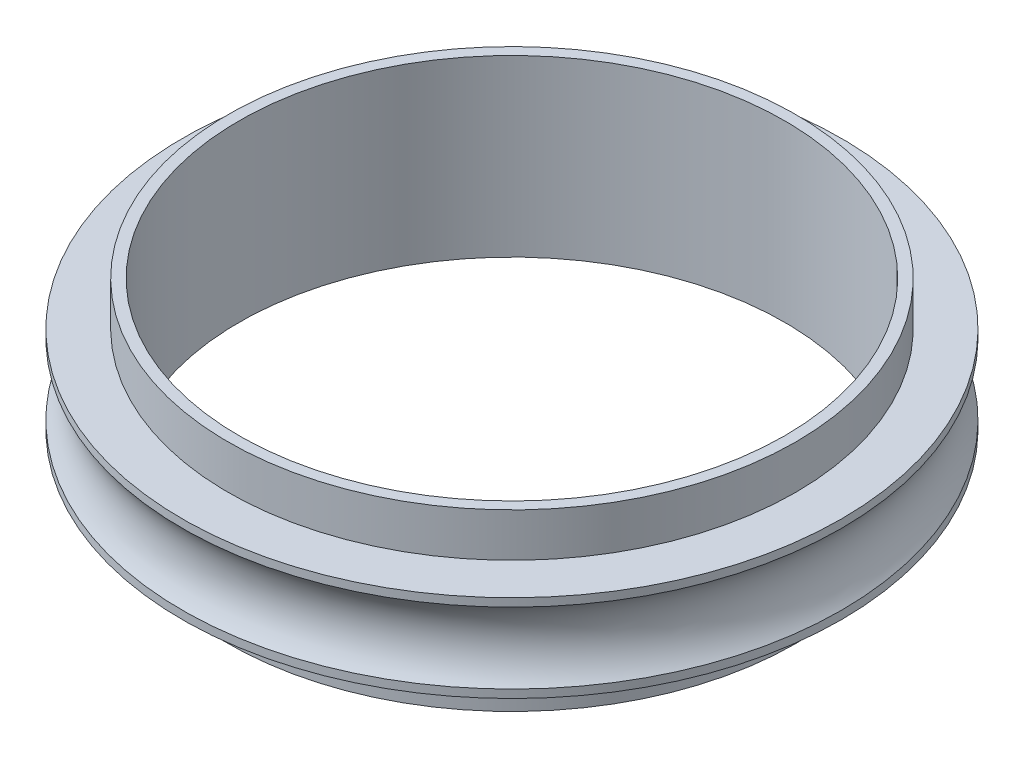
ISO-10303-21;
HEADER;
FILE_DESCRIPTION(('STEP AP214'),'2;1');
FILE_NAME('part.step','',(''),(''),'','','');
FILE_SCHEMA(('AUTOMOTIVE_DESIGN { 1 0 10303 214 1 1 1 1 }'));
ENDSEC;
DATA;
#1=APPLICATION_CONTEXT('core data for automotive mechanical design processes');
#2=APPLICATION_PROTOCOL_DEFINITION('international standard','automotive_design',2000,#1);
#3=PRODUCT_CONTEXT('',#1,'mechanical');
#4=PRODUCT('Part','Part','',(#3));
#5=PRODUCT_RELATED_PRODUCT_CATEGORY('part','',(#4));
#6=PRODUCT_DEFINITION_FORMATION('','',#4);
#7=PRODUCT_DEFINITION_CONTEXT('part definition',#1,'design');
#8=PRODUCT_DEFINITION('design','',#6,#7);
#9=PRODUCT_DEFINITION_SHAPE('','',#8);
#10=(LENGTH_UNIT() NAMED_UNIT(*) SI_UNIT(.MILLI.,.METRE.));
#11=(NAMED_UNIT(*) PLANE_ANGLE_UNIT() SI_UNIT($,.RADIAN.));
#12=(NAMED_UNIT(*) SI_UNIT($,.STERADIAN.) SOLID_ANGLE_UNIT());
#13=UNCERTAINTY_MEASURE_WITH_UNIT(LENGTH_MEASURE(1.E-05),#10,'distance_accuracy_value','');
#14=(GEOMETRIC_REPRESENTATION_CONTEXT(3) GLOBAL_UNCERTAINTY_ASSIGNED_CONTEXT((#13)) GLOBAL_UNIT_ASSIGNED_CONTEXT((#10,
#11,#12)) REPRESENTATION_CONTEXT('',''));
#15=CARTESIAN_POINT('',(0.,0.,0.));
#16=DIRECTION('',(0.,0.,1.));
#17=DIRECTION('',(1.,0.,0.));
#18=AXIS2_PLACEMENT_3D('',#15,#16,#17);
#19=CARTESIAN_POINT('',(17.,4.4,0.));
#20=DIRECTION('',(0.,-1.,0.));
#21=DIRECTION('',(-1.,0.,0.));
#22=AXIS2_PLACEMENT_3D('',#19,#20,#21);
#23=CYLINDRICAL_SURFACE('',#22,13.);
#24=CARTESIAN_POINT('',(17.,2.,0.));
#25=DIRECTION('',(0.,-1.,0.));
#26=DIRECTION('',(-1.,0.,0.));
#27=AXIS2_PLACEMENT_3D('',#24,#25,#26);
#28=CIRCLE('',#27,13.);
#29=CARTESIAN_POINT('',(30.,2.,0.));
#30=VERTEX_POINT('',#29);
#31=EDGE_CURVE('E26',#30,#30,#28,.T.);
#32=ORIENTED_EDGE('',*,*,#31,.F.);
#33=DIRECTION('',(0.,1.,0.));
#34=VECTOR('',#33,1.);
#35=CARTESIAN_POINT('',(30.,4.4,0.));
#36=LINE('',#35,#34);
#37=CARTESIAN_POINT('',(30.,4.,0.));
#38=VERTEX_POINT('',#37);
#39=EDGE_CURVE('E11',#30,#38,#36,.T.);
#40=ORIENTED_EDGE('',*,*,#39,.T.);
#41=CARTESIAN_POINT('',(17.,4.,0.));
#42=DIRECTION('',(0.,1.,0.));
#43=DIRECTION('',(-1.,0.,0.));
#44=AXIS2_PLACEMENT_3D('',#41,#42,#43);
#45=CIRCLE('',#44,13.);
#46=EDGE_CURVE('E105',#38,#38,#45,.T.);
#47=ORIENTED_EDGE('',*,*,#46,.F.);
#48=ORIENTED_EDGE('',*,*,#39,.F.);
#49=EDGE_LOOP('',(#32,#40,#47,#48));
#50=FACE_BOUND('',#49,.T.);
#51=ADVANCED_FACE('F17',(#50),#23,.T.);
#52=CARTESIAN_POINT('',(17.,2.,0.));
#53=DIRECTION('',(0.,-1.,0.));
#54=DIRECTION('',(0.,0.,-1.));
#55=AXIS2_PLACEMENT_3D('',#52,#53,#54);
#56=PLANE('',#55);
#57=ORIENTED_EDGE('',*,*,#31,.T.);
#58=EDGE_LOOP('',(#57));
#59=FACE_BOUND('',#58,.T.);
#60=CARTESIAN_POINT('',(17.,2.,0.));
#61=DIRECTION('',(0.,-1.,0.));
#62=DIRECTION('',(-1.,0.,0.));
#63=AXIS2_PLACEMENT_3D('',#60,#61,#62);
#64=CIRCLE('',#63,15.1);
#65=CARTESIAN_POINT('',(32.1,2.,0.));
#66=VERTEX_POINT('',#65);
#67=EDGE_CURVE('E116',#66,#66,#64,.T.);
#68=ORIENTED_EDGE('',*,*,#67,.F.);
#69=EDGE_LOOP('',(#68));
#70=FACE_BOUND('',#69,.T.);
#71=ADVANCED_FACE('F210',(#59,#70),#56,.F.);
#72=CARTESIAN_POINT('',(17.,4.4,0.));
#73=DIRECTION('',(0.,-1.,0.));
#74=DIRECTION('',(-1.,0.,0.));
#75=AXIS2_PLACEMENT_3D('',#72,#73,#74);
#76=CYLINDRICAL_SURFACE('',#75,15.1);
#77=CARTESIAN_POINT('',(17.,1.624807680927,0.));
#78=DIRECTION('',(0.,-1.,0.));
#79=DIRECTION('',(-1.,0.,0.));
#80=AXIS2_PLACEMENT_3D('',#77,#78,#79);
#81=CIRCLE('',#80,15.1);
#82=CARTESIAN_POINT('',(32.1,1.624807680927,0.));
#83=VERTEX_POINT('',#82);
#84=EDGE_CURVE('E145',#83,#83,#81,.T.);
#85=ORIENTED_EDGE('',*,*,#84,.F.);
#86=DIRECTION('',(0.,1.,0.));
#87=VECTOR('',#86,1.);
#88=CARTESIAN_POINT('',(32.1,4.4,0.));
#89=LINE('',#88,#87);
#90=EDGE_CURVE('E60',#83,#66,#89,.T.);
#91=ORIENTED_EDGE('',*,*,#90,.T.);
#92=ORIENTED_EDGE('',*,*,#67,.T.);
#93=ORIENTED_EDGE('',*,*,#90,.F.);
#94=EDGE_LOOP('',(#85,#91,#92,#93));
#95=FACE_BOUND('',#94,.T.);
#96=ADVANCED_FACE('F185',(#95),#76,.T.);
#97=CARTESIAN_POINT('',(17.,0.,0.));
#98=DIRECTION('',(0.,-1.,0.));
#99=DIRECTION('',(-1.,0.,0.));
#100=AXIS2_PLACEMENT_3D('',#97,#98,#99);
#101=TOROIDAL_SURFACE('',#100,17.,2.5);
#102=CARTESIAN_POINT('',(17.,-1.624807680927,0.));
#103=DIRECTION('',(0.,-1.,0.));
#104=DIRECTION('',(-1.,0.,0.));
#105=AXIS2_PLACEMENT_3D('',#102,#103,#104);
#106=CIRCLE('',#105,15.1);
#107=CARTESIAN_POINT('',(32.1,-1.624807680927,0.));
#108=VERTEX_POINT('',#107);
#109=EDGE_CURVE('E125',#108,#108,#106,.T.);
#110=ORIENTED_EDGE('',*,*,#109,.F.);
#111=CARTESIAN_POINT('',(34.,0.,0.));
#112=DIRECTION('',(0.,0.,-1.));
#113=DIRECTION('',(1.,0.,0.));
#114=AXIS2_PLACEMENT_3D('',#111,#112,#113);
#115=CIRCLE('',#114,2.5);
#116=EDGE_CURVE('E68',#108,#83,#115,.T.);
#117=ORIENTED_EDGE('',*,*,#116,.T.);
#118=ORIENTED_EDGE('',*,*,#84,.T.);
#119=ORIENTED_EDGE('',*,*,#116,.F.);
#120=EDGE_LOOP('',(#110,#117,#118,#119));
#121=FACE_BOUND('',#120,.T.);
#122=ADVANCED_FACE('F179',(#121),#101,.F.);
#123=CARTESIAN_POINT('',(17.,4.4,0.));
#124=DIRECTION('',(0.,-1.,0.));
#125=DIRECTION('',(-1.,0.,0.));
#126=AXIS2_PLACEMENT_3D('',#123,#124,#125);
#127=CYLINDRICAL_SURFACE('',#126,15.1);
#128=CARTESIAN_POINT('',(17.,-2.,0.));
#129=DIRECTION('',(0.,-1.,0.));
#130=DIRECTION('',(-1.,0.,0.));
#131=AXIS2_PLACEMENT_3D('',#128,#129,#130);
#132=CIRCLE('',#131,15.1);
#133=CARTESIAN_POINT('',(32.1,-2.,0.));
#134=VERTEX_POINT('',#133);
#135=EDGE_CURVE('E117',#134,#134,#132,.T.);
#136=ORIENTED_EDGE('',*,*,#135,.F.);
#137=DIRECTION('',(0.,1.,0.));
#138=VECTOR('',#137,1.);
#139=CARTESIAN_POINT('',(32.1,4.4,0.));
#140=LINE('',#139,#138);
#141=EDGE_CURVE('E76',#134,#108,#140,.T.);
#142=ORIENTED_EDGE('',*,*,#141,.T.);
#143=ORIENTED_EDGE('',*,*,#109,.T.);
#144=ORIENTED_EDGE('',*,*,#141,.F.);
#145=EDGE_LOOP('',(#136,#142,#143,#144));
#146=FACE_BOUND('',#145,.T.);
#147=ADVANCED_FACE('F184',(#146),#127,.T.);
#148=CARTESIAN_POINT('',(17.,-2.,0.));
#149=DIRECTION('',(0.,-1.,0.));
#150=DIRECTION('',(0.,0.,-1.));
#151=AXIS2_PLACEMENT_3D('',#148,#149,#150);
#152=PLANE('',#151);
#153=CARTESIAN_POINT('',(17.,-2.,0.));
#154=DIRECTION('',(0.,-1.,0.));
#155=DIRECTION('',(-1.,0.,0.));
#156=AXIS2_PLACEMENT_3D('',#153,#154,#155);
#157=CIRCLE('',#156,13.);
#158=CARTESIAN_POINT('',(30.,-2.,0.));
#159=VERTEX_POINT('',#158);
#160=EDGE_CURVE('E119',#159,#159,#157,.T.);
#161=ORIENTED_EDGE('',*,*,#160,.F.);
#162=EDGE_LOOP('',(#161));
#163=FACE_BOUND('',#162,.T.);
#164=ORIENTED_EDGE('',*,*,#135,.T.);
#165=EDGE_LOOP('',(#164));
#166=FACE_BOUND('',#165,.T.);
#167=ADVANCED_FACE('F204',(#163,#166),#152,.T.);
#168=CARTESIAN_POINT('',(17.,4.4,0.));
#169=DIRECTION('',(0.,-1.,0.));
#170=DIRECTION('',(-1.,0.,0.));
#171=AXIS2_PLACEMENT_3D('',#168,#169,#170);
#172=CYLINDRICAL_SURFACE('',#171,13.);
#173=CARTESIAN_POINT('',(17.,-4.,0.));
#174=DIRECTION('',(0.,-1.,0.));
#175=DIRECTION('',(-1.,0.,0.));
#176=AXIS2_PLACEMENT_3D('',#173,#174,#175);
#177=CIRCLE('',#176,13.);
#178=CARTESIAN_POINT('',(30.,-4.,0.));
#179=VERTEX_POINT('',#178);
#180=EDGE_CURVE('E134',#179,#179,#177,.T.);
#181=ORIENTED_EDGE('',*,*,#180,.F.);
#182=DIRECTION('',(0.,1.,0.));
#183=VECTOR('',#182,1.);
#184=CARTESIAN_POINT('',(30.,4.4,0.));
#185=LINE('',#184,#183);
#186=EDGE_CURVE('E126',#179,#159,#185,.T.);
#187=ORIENTED_EDGE('',*,*,#186,.T.);
#188=ORIENTED_EDGE('',*,*,#160,.T.);
#189=ORIENTED_EDGE('',*,*,#186,.F.);
#190=EDGE_LOOP('',(#181,#187,#188,#189));
#191=FACE_BOUND('',#190,.T.);
#192=ADVANCED_FACE('F198',(#191),#172,.T.);
#193=CARTESIAN_POINT('',(17.,-4.,0.));
#194=DIRECTION('',(0.,-1.,0.));
#195=DIRECTION('',(0.,0.,-1.));
#196=AXIS2_PLACEMENT_3D('',#193,#194,#195);
#197=PLANE('',#196);
#198=CARTESIAN_POINT('',(17.,-4.,0.));
#199=DIRECTION('',(0.,-1.,0.));
#200=DIRECTION('',(-1.,0.,0.));
#201=AXIS2_PLACEMENT_3D('',#198,#199,#200);
#202=CIRCLE('',#201,12.5);
#203=CARTESIAN_POINT('',(29.5,-4.,0.));
#204=VERTEX_POINT('',#203);
#205=EDGE_CURVE('E90',#204,#204,#202,.T.);
#206=ORIENTED_EDGE('',*,*,#205,.F.);
#207=EDGE_LOOP('',(#206));
#208=FACE_BOUND('',#207,.T.);
#209=ORIENTED_EDGE('',*,*,#180,.T.);
#210=EDGE_LOOP('',(#209));
#211=FACE_BOUND('',#210,.T.);
#212=ADVANCED_FACE('F203',(#208,#211),#197,.T.);
#213=CARTESIAN_POINT('',(17.,4.4,0.));
#214=DIRECTION('',(0.,-1.,0.));
#215=DIRECTION('',(-1.,0.,0.));
#216=AXIS2_PLACEMENT_3D('',#213,#214,#215);
#217=CYLINDRICAL_SURFACE('',#216,12.5);
#218=CARTESIAN_POINT('',(17.,4.,0.));
#219=DIRECTION('',(0.,-1.,0.));
#220=DIRECTION('',(-1.,0.,0.));
#221=AXIS2_PLACEMENT_3D('',#218,#219,#220);
#222=CIRCLE('',#221,12.5);
#223=CARTESIAN_POINT('',(29.5,4.,0.));
#224=VERTEX_POINT('',#223);
#225=EDGE_CURVE('E98',#224,#224,#222,.T.);
#226=ORIENTED_EDGE('',*,*,#225,.F.);
#227=DIRECTION('',(0.,-1.,0.));
#228=VECTOR('',#227,1.);
#229=CARTESIAN_POINT('',(29.5,4.4,0.));
#230=LINE('',#229,#228);
#231=EDGE_CURVE('E95',#224,#204,#230,.T.);
#232=ORIENTED_EDGE('',*,*,#231,.T.);
#233=ORIENTED_EDGE('',*,*,#205,.T.);
#234=ORIENTED_EDGE('',*,*,#231,.F.);
#235=EDGE_LOOP('',(#226,#232,#233,#234));
#236=FACE_BOUND('',#235,.T.);
#237=ADVANCED_FACE('F97',(#236),#217,.F.);
#238=CARTESIAN_POINT('',(17.,4.,0.));
#239=DIRECTION('',(0.,-1.,0.));
#240=DIRECTION('',(0.,0.,-1.));
#241=AXIS2_PLACEMENT_3D('',#238,#239,#240);
#242=PLANE('',#241);
#243=ORIENTED_EDGE('',*,*,#225,.T.);
#244=EDGE_LOOP('',(#243));
#245=FACE_BOUND('',#244,.T.);
#246=ORIENTED_EDGE('',*,*,#46,.T.);
#247=EDGE_LOOP('',(#246));
#248=FACE_BOUND('',#247,.T.);
#249=ADVANCED_FACE('F102',(#245,#248),#242,.F.);
#250=CLOSED_SHELL('',(#51,#71,#96,#122,#147,#167,#192,#212,#237,#249));
#251=MANIFOLD_SOLID_BREP('B1',#250);
#252=ADVANCED_BREP_SHAPE_REPRESENTATION('',(#18,#251),#14);
#253=SHAPE_DEFINITION_REPRESENTATION(#9,#252);
ENDSEC;
END-ISO-10303-21;
